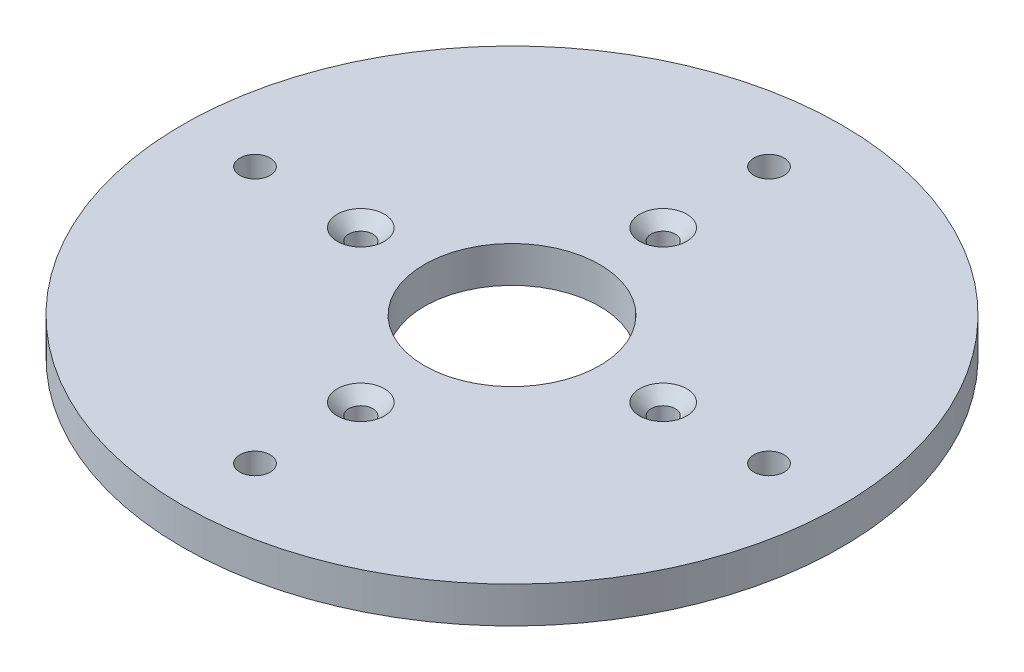
ISO-10303-21;
HEADER;
FILE_DESCRIPTION(('STEP AP214'),'2;1');
FILE_NAME('part.step','',(''),(''),'','','');
FILE_SCHEMA(('AUTOMOTIVE_DESIGN { 1 0 10303 214 1 1 1 1 }'));
ENDSEC;
DATA;
#1=APPLICATION_CONTEXT('core data for automotive mechanical design processes');
#2=APPLICATION_PROTOCOL_DEFINITION('international standard','automotive_design',2000,#1);
#3=PRODUCT_CONTEXT('',#1,'mechanical');
#4=PRODUCT('Part','Part','',(#3));
#5=PRODUCT_RELATED_PRODUCT_CATEGORY('part','',(#4));
#6=PRODUCT_DEFINITION_FORMATION('','',#4);
#7=PRODUCT_DEFINITION_CONTEXT('part definition',#1,'design');
#8=PRODUCT_DEFINITION('design','',#6,#7);
#9=PRODUCT_DEFINITION_SHAPE('','',#8);
#10=(LENGTH_UNIT() NAMED_UNIT(*) SI_UNIT(.MILLI.,.METRE.));
#11=(NAMED_UNIT(*) PLANE_ANGLE_UNIT() SI_UNIT($,.RADIAN.));
#12=(NAMED_UNIT(*) SI_UNIT($,.STERADIAN.) SOLID_ANGLE_UNIT());
#13=UNCERTAINTY_MEASURE_WITH_UNIT(LENGTH_MEASURE(1.E-05),#10,'distance_accuracy_value','');
#14=(GEOMETRIC_REPRESENTATION_CONTEXT(3) GLOBAL_UNCERTAINTY_ASSIGNED_CONTEXT((#13)) GLOBAL_UNIT_ASSIGNED_CONTEXT((#10,
#11,#12)) REPRESENTATION_CONTEXT('',''));
#15=CARTESIAN_POINT('',(0.,0.,0.));
#16=DIRECTION('',(0.,0.,1.));
#17=DIRECTION('',(1.,0.,0.));
#18=AXIS2_PLACEMENT_3D('',#15,#16,#17);
#19=CARTESIAN_POINT('',(0.,6.,0.));
#20=DIRECTION('',(0.,1.,0.));
#21=DIRECTION('',(0.,0.,1.));
#22=AXIS2_PLACEMENT_3D('',#19,#20,#21);
#23=PLANE('',#22);
#24=CARTESIAN_POINT('',(0.,6.,-25.));
#25=DIRECTION('',(0.,1.,0.));
#26=DIRECTION('',(0.,0.,1.));
#27=AXIS2_PLACEMENT_3D('',#24,#25,#26);
#28=CIRCLE('',#27,3.90000000000004);
#29=CARTESIAN_POINT('',(0.,6.,-21.1));
#30=VERTEX_POINT('',#29);
#31=EDGE_CURVE('E45',#30,#30,#28,.F.);
#32=ORIENTED_EDGE('',*,*,#31,.T.);
#33=EDGE_LOOP('',(#32));
#34=FACE_BOUND('',#33,.T.);
#35=CARTESIAN_POINT('',(25.,6.,0.));
#36=DIRECTION('',(0.,1.,0.));
#37=DIRECTION('',(0.,0.,1.));
#38=AXIS2_PLACEMENT_3D('',#35,#36,#37);
#39=CIRCLE('',#38,3.9);
#40=CARTESIAN_POINT('',(25.,6.,3.9));
#41=VERTEX_POINT('',#40);
#42=EDGE_CURVE('E50',#41,#41,#39,.F.);
#43=ORIENTED_EDGE('',*,*,#42,.T.);
#44=EDGE_LOOP('',(#43));
#45=FACE_BOUND('',#44,.T.);
#46=CARTESIAN_POINT('',(0.,6.,25.));
#47=DIRECTION('',(0.,1.,0.));
#48=DIRECTION('',(0.,0.,1.));
#49=AXIS2_PLACEMENT_3D('',#46,#47,#48);
#50=CIRCLE('',#49,3.9);
#51=CARTESIAN_POINT('',(0.,6.,28.9));
#52=VERTEX_POINT('',#51);
#53=EDGE_CURVE('E53',#52,#52,#50,.F.);
#54=ORIENTED_EDGE('',*,*,#53,.T.);
#55=EDGE_LOOP('',(#54));
#56=FACE_BOUND('',#55,.T.);
#57=CARTESIAN_POINT('',(-25.,6.,0.));
#58=DIRECTION('',(0.,1.,0.));
#59=DIRECTION('',(0.,0.,1.));
#60=AXIS2_PLACEMENT_3D('',#57,#58,#59);
#61=CIRCLE('',#60,3.9);
#62=CARTESIAN_POINT('',(-25.,6.,3.9));
#63=VERTEX_POINT('',#62);
#64=EDGE_CURVE('E56',#63,#63,#61,.F.);
#65=ORIENTED_EDGE('',*,*,#64,.T.);
#66=EDGE_LOOP('',(#65));
#67=FACE_BOUND('',#66,.T.);
#68=CARTESIAN_POINT('',(42.5,6.,0.));
#69=DIRECTION('',(0.,1.,0.));
#70=DIRECTION('',(0.,0.,1.));
#71=AXIS2_PLACEMENT_3D('',#68,#69,#70);
#72=CIRCLE('',#71,2.5);
#73=CARTESIAN_POINT('',(42.5,6.,2.5));
#74=VERTEX_POINT('',#73);
#75=EDGE_CURVE('E75',#74,#74,#72,.T.);
#76=ORIENTED_EDGE('',*,*,#75,.F.);
#77=EDGE_LOOP('',(#76));
#78=FACE_BOUND('',#77,.T.);
#79=CARTESIAN_POINT('',(-42.5,6.,0.));
#80=DIRECTION('',(0.,1.,0.));
#81=DIRECTION('',(0.,0.,1.));
#82=AXIS2_PLACEMENT_3D('',#79,#80,#81);
#83=CIRCLE('',#82,2.5);
#84=CARTESIAN_POINT('',(-42.5,6.,2.5));
#85=VERTEX_POINT('',#84);
#86=EDGE_CURVE('E79',#85,#85,#83,.T.);
#87=ORIENTED_EDGE('',*,*,#86,.F.);
#88=EDGE_LOOP('',(#87));
#89=FACE_BOUND('',#88,.T.);
#90=CARTESIAN_POINT('',(0.,6.,42.5));
#91=DIRECTION('',(0.,1.,0.));
#92=DIRECTION('',(0.,0.,1.));
#93=AXIS2_PLACEMENT_3D('',#90,#91,#92);
#94=CIRCLE('',#93,2.5);
#95=CARTESIAN_POINT('',(0.,6.,45.));
#96=VERTEX_POINT('',#95);
#97=EDGE_CURVE('E83',#96,#96,#94,.T.);
#98=ORIENTED_EDGE('',*,*,#97,.F.);
#99=EDGE_LOOP('',(#98));
#100=FACE_BOUND('',#99,.T.);
#101=CARTESIAN_POINT('',(0.,6.,-42.5));
#102=DIRECTION('',(0.,1.,0.));
#103=DIRECTION('',(0.,0.,1.));
#104=AXIS2_PLACEMENT_3D('',#101,#102,#103);
#105=CIRCLE('',#104,2.5);
#106=CARTESIAN_POINT('',(0.,6.,-40.));
#107=VERTEX_POINT('',#106);
#108=EDGE_CURVE('E87',#107,#107,#105,.T.);
#109=ORIENTED_EDGE('',*,*,#108,.F.);
#110=EDGE_LOOP('',(#109));
#111=FACE_BOUND('',#110,.T.);
#112=CARTESIAN_POINT('',(0.,6.,0.));
#113=DIRECTION('',(0.,1.,0.));
#114=DIRECTION('',(0.,0.,1.));
#115=AXIS2_PLACEMENT_3D('',#112,#113,#114);
#116=CIRCLE('',#115,54.5);
#117=CARTESIAN_POINT('',(0.,6.,54.5));
#118=VERTEX_POINT('',#117);
#119=EDGE_CURVE('E62',#118,#118,#116,.T.);
#120=ORIENTED_EDGE('',*,*,#119,.T.);
#121=EDGE_LOOP('',(#120));
#122=FACE_BOUND('',#121,.T.);
#123=CARTESIAN_POINT('',(0.,6.,0.));
#124=DIRECTION('',(0.,1.,0.));
#125=DIRECTION('',(0.,0.,1.));
#126=AXIS2_PLACEMENT_3D('',#123,#124,#125);
#127=CIRCLE('',#126,14.5);
#128=CARTESIAN_POINT('',(0.,6.,14.5));
#129=VERTEX_POINT('',#128);
#130=EDGE_CURVE('E95',#129,#129,#127,.T.);
#131=ORIENTED_EDGE('',*,*,#130,.F.);
#132=EDGE_LOOP('',(#131));
#133=FACE_BOUND('',#132,.T.);
#134=ADVANCED_FACE('F30',(#34,#45,#56,#67,#78,#89,#100,#111,#122,#133),#23,.T.);
#135=CARTESIAN_POINT('',(0.,0.,0.));
#136=DIRECTION('',(0.,1.,0.));
#137=DIRECTION('',(0.,0.,1.));
#138=AXIS2_PLACEMENT_3D('',#135,#136,#137);
#139=PLANE('',#138);
#140=CARTESIAN_POINT('',(25.,0.,0.));
#141=DIRECTION('',(0.,1.,0.));
#142=DIRECTION('',(0.,0.,1.));
#143=AXIS2_PLACEMENT_3D('',#140,#141,#142);
#144=CIRCLE('',#143,2.);
#145=CARTESIAN_POINT('',(25.,0.,2.));
#146=VERTEX_POINT('',#145);
#147=EDGE_CURVE('E63',#146,#146,#144,.T.);
#148=ORIENTED_EDGE('',*,*,#147,.T.);
#149=EDGE_LOOP('',(#148));
#150=FACE_BOUND('',#149,.T.);
#151=CARTESIAN_POINT('',(0.,0.,25.));
#152=DIRECTION('',(0.,1.,0.));
#153=DIRECTION('',(0.,0.,1.));
#154=AXIS2_PLACEMENT_3D('',#151,#152,#153);
#155=CIRCLE('',#154,2.);
#156=CARTESIAN_POINT('',(0.,0.,27.));
#157=VERTEX_POINT('',#156);
#158=EDGE_CURVE('E66',#157,#157,#155,.T.);
#159=ORIENTED_EDGE('',*,*,#158,.T.);
#160=EDGE_LOOP('',(#159));
#161=FACE_BOUND('',#160,.T.);
#162=CARTESIAN_POINT('',(-25.,0.,0.));
#163=DIRECTION('',(0.,1.,0.));
#164=DIRECTION('',(0.,0.,1.));
#165=AXIS2_PLACEMENT_3D('',#162,#163,#164);
#166=CIRCLE('',#165,2.);
#167=CARTESIAN_POINT('',(-25.,0.,2.));
#168=VERTEX_POINT('',#167);
#169=EDGE_CURVE('E69',#168,#168,#166,.T.);
#170=ORIENTED_EDGE('',*,*,#169,.T.);
#171=EDGE_LOOP('',(#170));
#172=FACE_BOUND('',#171,.T.);
#173=CARTESIAN_POINT('',(0.,0.,-25.));
#174=DIRECTION('',(0.,1.,0.));
#175=DIRECTION('',(0.,0.,1.));
#176=AXIS2_PLACEMENT_3D('',#173,#174,#175);
#177=CIRCLE('',#176,2.);
#178=CARTESIAN_POINT('',(0.,0.,-23.));
#179=VERTEX_POINT('',#178);
#180=EDGE_CURVE('E72',#179,#179,#177,.T.);
#181=ORIENTED_EDGE('',*,*,#180,.T.);
#182=EDGE_LOOP('',(#181));
#183=FACE_BOUND('',#182,.T.);
#184=CARTESIAN_POINT('',(42.5,0.,0.));
#185=DIRECTION('',(0.,1.,0.));
#186=DIRECTION('',(0.,0.,1.));
#187=AXIS2_PLACEMENT_3D('',#184,#185,#186);
#188=CIRCLE('',#187,2.5);
#189=CARTESIAN_POINT('',(42.5,0.,2.5));
#190=VERTEX_POINT('',#189);
#191=EDGE_CURVE('E76',#190,#190,#188,.T.);
#192=ORIENTED_EDGE('',*,*,#191,.T.);
#193=EDGE_LOOP('',(#192));
#194=FACE_BOUND('',#193,.T.);
#195=CARTESIAN_POINT('',(-42.5,0.,0.));
#196=DIRECTION('',(0.,1.,0.));
#197=DIRECTION('',(0.,0.,1.));
#198=AXIS2_PLACEMENT_3D('',#195,#196,#197);
#199=CIRCLE('',#198,2.5);
#200=CARTESIAN_POINT('',(-42.5,0.,2.5));
#201=VERTEX_POINT('',#200);
#202=EDGE_CURVE('E80',#201,#201,#199,.T.);
#203=ORIENTED_EDGE('',*,*,#202,.T.);
#204=EDGE_LOOP('',(#203));
#205=FACE_BOUND('',#204,.T.);
#206=CARTESIAN_POINT('',(0.,0.,42.5));
#207=DIRECTION('',(0.,1.,0.));
#208=DIRECTION('',(0.,0.,1.));
#209=AXIS2_PLACEMENT_3D('',#206,#207,#208);
#210=CIRCLE('',#209,2.5);
#211=CARTESIAN_POINT('',(0.,0.,45.));
#212=VERTEX_POINT('',#211);
#213=EDGE_CURVE('E84',#212,#212,#210,.T.);
#214=ORIENTED_EDGE('',*,*,#213,.T.);
#215=EDGE_LOOP('',(#214));
#216=FACE_BOUND('',#215,.T.);
#217=CARTESIAN_POINT('',(0.,0.,-42.5));
#218=DIRECTION('',(0.,1.,0.));
#219=DIRECTION('',(0.,0.,1.));
#220=AXIS2_PLACEMENT_3D('',#217,#218,#219);
#221=CIRCLE('',#220,2.5);
#222=CARTESIAN_POINT('',(0.,0.,-40.));
#223=VERTEX_POINT('',#222);
#224=EDGE_CURVE('E88',#223,#223,#221,.T.);
#225=ORIENTED_EDGE('',*,*,#224,.T.);
#226=EDGE_LOOP('',(#225));
#227=FACE_BOUND('',#226,.T.);
#228=CARTESIAN_POINT('',(0.,0.,0.));
#229=DIRECTION('',(0.,1.,0.));
#230=DIRECTION('',(0.,0.,1.));
#231=AXIS2_PLACEMENT_3D('',#228,#229,#230);
#232=CIRCLE('',#231,54.5);
#233=CARTESIAN_POINT('',(0.,0.,54.5));
#234=VERTEX_POINT('',#233);
#235=EDGE_CURVE('E92',#234,#234,#232,.T.);
#236=ORIENTED_EDGE('',*,*,#235,.F.);
#237=EDGE_LOOP('',(#236));
#238=FACE_BOUND('',#237,.T.);
#239=CARTESIAN_POINT('',(0.,0.,0.));
#240=DIRECTION('',(0.,1.,0.));
#241=DIRECTION('',(0.,0.,1.));
#242=AXIS2_PLACEMENT_3D('',#239,#240,#241);
#243=CIRCLE('',#242,14.5);
#244=CARTESIAN_POINT('',(0.,0.,14.5));
#245=VERTEX_POINT('',#244);
#246=EDGE_CURVE('E91',#245,#245,#243,.T.);
#247=ORIENTED_EDGE('',*,*,#246,.T.);
#248=EDGE_LOOP('',(#247));
#249=FACE_BOUND('',#248,.T.);
#250=ADVANCED_FACE('F116',(#150,#161,#172,#183,#194,#205,#216,#227,#238,#249),#139,.F.);
#251=CARTESIAN_POINT('',(0.,6.,0.));
#252=DIRECTION('',(0.,-1.,0.));
#253=DIRECTION('',(0.,0.,-1.));
#254=AXIS2_PLACEMENT_3D('',#251,#252,#253);
#255=CYLINDRICAL_SURFACE('',#254,54.5);
#256=ORIENTED_EDGE('',*,*,#119,.F.);
#257=EDGE_LOOP('',(#256));
#258=FACE_BOUND('',#257,.T.);
#259=ORIENTED_EDGE('',*,*,#235,.T.);
#260=EDGE_LOOP('',(#259));
#261=FACE_BOUND('',#260,.T.);
#262=ADVANCED_FACE('F133',(#258,#261),#255,.T.);
#263=CARTESIAN_POINT('',(0.,6.,0.));
#264=DIRECTION('',(0.,-1.,0.));
#265=DIRECTION('',(0.,0.,-1.));
#266=AXIS2_PLACEMENT_3D('',#263,#264,#265);
#267=CYLINDRICAL_SURFACE('',#266,14.5);
#268=ORIENTED_EDGE('',*,*,#130,.T.);
#269=EDGE_LOOP('',(#268));
#270=FACE_BOUND('',#269,.T.);
#271=ORIENTED_EDGE('',*,*,#246,.F.);
#272=EDGE_LOOP('',(#271));
#273=FACE_BOUND('',#272,.T.);
#274=ADVANCED_FACE('F129',(#270,#273),#267,.F.);
#275=CARTESIAN_POINT('',(0.,-4.,-42.5));
#276=DIRECTION('',(0.,1.,0.));
#277=DIRECTION('',(0.,0.,1.));
#278=AXIS2_PLACEMENT_3D('',#275,#276,#277);
#279=CYLINDRICAL_SURFACE('',#278,2.5);
#280=ORIENTED_EDGE('',*,*,#108,.T.);
#281=EDGE_LOOP('',(#280));
#282=FACE_BOUND('',#281,.T.);
#283=ORIENTED_EDGE('',*,*,#224,.F.);
#284=EDGE_LOOP('',(#283));
#285=FACE_BOUND('',#284,.T.);
#286=ADVANCED_FACE('F132',(#282,#285),#279,.F.);
#287=CARTESIAN_POINT('',(0.,-4.,42.5));
#288=DIRECTION('',(0.,1.,0.));
#289=DIRECTION('',(0.,0.,1.));
#290=AXIS2_PLACEMENT_3D('',#287,#288,#289);
#291=CYLINDRICAL_SURFACE('',#290,2.5);
#292=ORIENTED_EDGE('',*,*,#97,.T.);
#293=EDGE_LOOP('',(#292));
#294=FACE_BOUND('',#293,.T.);
#295=ORIENTED_EDGE('',*,*,#213,.F.);
#296=EDGE_LOOP('',(#295));
#297=FACE_BOUND('',#296,.T.);
#298=ADVANCED_FACE('F252',(#294,#297),#291,.F.);
#299=CARTESIAN_POINT('',(-42.5,-4.,0.));
#300=DIRECTION('',(0.,1.,0.));
#301=DIRECTION('',(0.,0.,1.));
#302=AXIS2_PLACEMENT_3D('',#299,#300,#301);
#303=CYLINDRICAL_SURFACE('',#302,2.5);
#304=ORIENTED_EDGE('',*,*,#86,.T.);
#305=EDGE_LOOP('',(#304));
#306=FACE_BOUND('',#305,.T.);
#307=ORIENTED_EDGE('',*,*,#202,.F.);
#308=EDGE_LOOP('',(#307));
#309=FACE_BOUND('',#308,.T.);
#310=ADVANCED_FACE('F243',(#306,#309),#303,.F.);
#311=CARTESIAN_POINT('',(42.5,-4.,0.));
#312=DIRECTION('',(0.,1.,0.));
#313=DIRECTION('',(0.,0.,1.));
#314=AXIS2_PLACEMENT_3D('',#311,#312,#313);
#315=CYLINDRICAL_SURFACE('',#314,2.5);
#316=ORIENTED_EDGE('',*,*,#75,.T.);
#317=EDGE_LOOP('',(#316));
#318=FACE_BOUND('',#317,.T.);
#319=ORIENTED_EDGE('',*,*,#191,.F.);
#320=EDGE_LOOP('',(#319));
#321=FACE_BOUND('',#320,.T.);
#322=ADVANCED_FACE('F111',(#318,#321),#315,.F.);
#323=CARTESIAN_POINT('',(0.,-4.,-25.));
#324=DIRECTION('',(0.,1.,0.));
#325=DIRECTION('',(0.,0.,1.));
#326=AXIS2_PLACEMENT_3D('',#323,#324,#325);
#327=CYLINDRICAL_SURFACE('',#326,2.);
#328=CARTESIAN_POINT('',(0.,4.09999999999995,-25.));
#329=DIRECTION('',(0.,1.,0.));
#330=DIRECTION('',(0.,0.,1.));
#331=AXIS2_PLACEMENT_3D('',#328,#329,#330);
#332=CIRCLE('',#331,2.);
#333=CARTESIAN_POINT('',(0.,4.09999999999995,-23.));
#334=VERTEX_POINT('',#333);
#335=EDGE_CURVE('E59',#334,#334,#332,.T.);
#336=ORIENTED_EDGE('',*,*,#335,.T.);
#337=EDGE_LOOP('',(#336));
#338=FACE_BOUND('',#337,.T.);
#339=ORIENTED_EDGE('',*,*,#180,.F.);
#340=EDGE_LOOP('',(#339));
#341=FACE_BOUND('',#340,.T.);
#342=ADVANCED_FACE('F214',(#338,#341),#327,.F.);
#343=CARTESIAN_POINT('',(-25.,-4.,0.));
#344=DIRECTION('',(0.,1.,0.));
#345=DIRECTION('',(0.,0.,1.));
#346=AXIS2_PLACEMENT_3D('',#343,#344,#345);
#347=CYLINDRICAL_SURFACE('',#346,2.);
#348=CARTESIAN_POINT('',(-25.,4.1,0.));
#349=DIRECTION('',(0.,1.,0.));
#350=DIRECTION('',(0.,0.,1.));
#351=AXIS2_PLACEMENT_3D('',#348,#349,#350);
#352=CIRCLE('',#351,2.);
#353=CARTESIAN_POINT('',(-25.,4.1,2.));
#354=VERTEX_POINT('',#353);
#355=EDGE_CURVE('E10',#354,#354,#352,.T.);
#356=ORIENTED_EDGE('',*,*,#355,.T.);
#357=EDGE_LOOP('',(#356));
#358=FACE_BOUND('',#357,.T.);
#359=ORIENTED_EDGE('',*,*,#169,.F.);
#360=EDGE_LOOP('',(#359));
#361=FACE_BOUND('',#360,.T.);
#362=ADVANCED_FACE('F205',(#358,#361),#347,.F.);
#363=CARTESIAN_POINT('',(0.,-4.,25.));
#364=DIRECTION('',(0.,1.,0.));
#365=DIRECTION('',(0.,0.,1.));
#366=AXIS2_PLACEMENT_3D('',#363,#364,#365);
#367=CYLINDRICAL_SURFACE('',#366,2.);
#368=CARTESIAN_POINT('',(0.,4.09999999999999,25.));
#369=DIRECTION('',(0.,1.,0.));
#370=DIRECTION('',(0.,0.,1.));
#371=AXIS2_PLACEMENT_3D('',#368,#369,#370);
#372=CIRCLE('',#371,2.);
#373=CARTESIAN_POINT('',(0.,4.09999999999999,27.));
#374=VERTEX_POINT('',#373);
#375=EDGE_CURVE('E37',#374,#374,#372,.T.);
#376=ORIENTED_EDGE('',*,*,#375,.T.);
#377=EDGE_LOOP('',(#376));
#378=FACE_BOUND('',#377,.T.);
#379=ORIENTED_EDGE('',*,*,#158,.F.);
#380=EDGE_LOOP('',(#379));
#381=FACE_BOUND('',#380,.T.);
#382=ADVANCED_FACE('F195',(#378,#381),#367,.F.);
#383=CARTESIAN_POINT('',(25.,-4.,0.));
#384=DIRECTION('',(0.,1.,0.));
#385=DIRECTION('',(0.,0.,1.));
#386=AXIS2_PLACEMENT_3D('',#383,#384,#385);
#387=CYLINDRICAL_SURFACE('',#386,2.);
#388=CARTESIAN_POINT('',(25.,4.1,0.));
#389=DIRECTION('',(0.,1.,0.));
#390=DIRECTION('',(0.,0.,1.));
#391=AXIS2_PLACEMENT_3D('',#388,#389,#390);
#392=CIRCLE('',#391,2.);
#393=CARTESIAN_POINT('',(25.,4.1,2.));
#394=VERTEX_POINT('',#393);
#395=EDGE_CURVE('E41',#394,#394,#392,.T.);
#396=ORIENTED_EDGE('',*,*,#395,.T.);
#397=EDGE_LOOP('',(#396));
#398=FACE_BOUND('',#397,.T.);
#399=ORIENTED_EDGE('',*,*,#147,.F.);
#400=EDGE_LOOP('',(#399));
#401=FACE_BOUND('',#400,.T.);
#402=ADVANCED_FACE('F151',(#398,#401),#387,.F.);
#403=CARTESIAN_POINT('',(0.,4.09999999999995,-25.));
#404=DIRECTION('',(0.,1.,0.));
#405=DIRECTION('',(0.,0.,1.));
#406=AXIS2_PLACEMENT_3D('',#403,#404,#405);
#407=CONICAL_SURFACE('',#406,2.,0.785398163397446);
#408=CARTESIAN_POINT('',(0.,6.,-21.1));
#409=CARTESIAN_POINT('',(0.,5.98020833333333,-21.1197916666666));
#410=CARTESIAN_POINT('',(0.,5.96041666666667,-21.1395833333333));
#411=CARTESIAN_POINT('',(0.,5.92083333333333,-21.1791666666666));
#412=CARTESIAN_POINT('',(0.,5.90104166666666,-21.1989583333333));
#413=CARTESIAN_POINT('',(0.,5.86145833333333,-21.2385416666666));
#414=CARTESIAN_POINT('',(0.,5.84166666666666,-21.2583333333333));
#415=CARTESIAN_POINT('',(0.,5.80208333333333,-21.2979166666666));
#416=CARTESIAN_POINT('',(0.,5.78229166666666,-21.3177083333333));
#417=CARTESIAN_POINT('',(0.,5.74270833333333,-21.3572916666666));
#418=CARTESIAN_POINT('',(0.,5.72291666666666,-21.3770833333333));
#419=CARTESIAN_POINT('',(0.,5.68333333333332,-21.4166666666666));
#420=CARTESIAN_POINT('',(0.,5.66354166666666,-21.4364583333333));
#421=CARTESIAN_POINT('',(0.,5.62395833333332,-21.4760416666666));
#422=CARTESIAN_POINT('',(0.,5.60416666666666,-21.4958333333333));
#423=CARTESIAN_POINT('',(0.,5.56458333333332,-21.5354166666666));
#424=CARTESIAN_POINT('',(0.,5.54479166666665,-21.5552083333333));
#425=CARTESIAN_POINT('',(0.,5.50520833333332,-21.5947916666666));
#426=CARTESIAN_POINT('',(0.,5.48541666666665,-21.6145833333333));
#427=CARTESIAN_POINT('',(0.,5.44583333333332,-21.6541666666666));
#428=CARTESIAN_POINT('',(0.,5.42604166666665,-21.6739583333333));
#429=CARTESIAN_POINT('',(0.,5.38645833333332,-21.7135416666666));
#430=CARTESIAN_POINT('',(0.,5.36666666666665,-21.7333333333333));
#431=CARTESIAN_POINT('',(0.,5.32708333333332,-21.7729166666666));
#432=CARTESIAN_POINT('',(0.,5.30729166666665,-21.7927083333333));
#433=CARTESIAN_POINT('',(0.,5.26770833333331,-21.8322916666666));
#434=CARTESIAN_POINT('',(0.,5.24791666666665,-21.8520833333333));
#435=CARTESIAN_POINT('',(0.,5.20833333333331,-21.8916666666666));
#436=CARTESIAN_POINT('',(0.,5.18854166666665,-21.9114583333333));
#437=CARTESIAN_POINT('',(0.,5.14895833333331,-21.9510416666666));
#438=CARTESIAN_POINT('',(0.,5.12916666666664,-21.9708333333333));
#439=CARTESIAN_POINT('',(0.,5.08958333333331,-22.0104166666666));
#440=CARTESIAN_POINT('',(0.,5.06979166666664,-22.0302083333333));
#441=CARTESIAN_POINT('',(0.,5.03020833333331,-22.0697916666666));
#442=CARTESIAN_POINT('',(0.,5.01041666666664,-22.0895833333333));
#443=CARTESIAN_POINT('',(0.,4.97083333333331,-22.1291666666666));
#444=CARTESIAN_POINT('',(0.,4.95104166666664,-22.1489583333333));
#445=CARTESIAN_POINT('',(0.,4.9114583333333,-22.1885416666667));
#446=CARTESIAN_POINT('',(0.,4.89166666666664,-22.2083333333333));
#447=CARTESIAN_POINT('',(0.,4.8520833333333,-22.2479166666667));
#448=CARTESIAN_POINT('',(0.,4.83229166666664,-22.2677083333333));
#449=CARTESIAN_POINT('',(0.,4.7927083333333,-22.3072916666667));
#450=CARTESIAN_POINT('',(0.,4.77291666666663,-22.3270833333333));
#451=CARTESIAN_POINT('',(0.,4.7333333333333,-22.3666666666667));
#452=CARTESIAN_POINT('',(0.,4.71354166666663,-22.3864583333333));
#453=CARTESIAN_POINT('',(0.,4.6739583333333,-22.4260416666667));
#454=CARTESIAN_POINT('',(0.,4.65416666666663,-22.4458333333333));
#455=CARTESIAN_POINT('',(0.,4.6145833333333,-22.4854166666667));
#456=CARTESIAN_POINT('',(0.,4.59479166666663,-22.5052083333333));
#457=CARTESIAN_POINT('',(0.,4.5552083333333,-22.5447916666667));
#458=CARTESIAN_POINT('',(0.,4.53541666666663,-22.5645833333333));
#459=CARTESIAN_POINT('',(0.,4.49583333333329,-22.6041666666667));
#460=CARTESIAN_POINT('',(0.,4.47604166666663,-22.6239583333333));
#461=CARTESIAN_POINT('',(0.,4.43645833333329,-22.6635416666667));
#462=CARTESIAN_POINT('',(0.,4.41666666666662,-22.6833333333333));
#463=CARTESIAN_POINT('',(0.,4.37708333333329,-22.7229166666667));
#464=CARTESIAN_POINT('',(0.,4.35729166666662,-22.7427083333333));
#465=CARTESIAN_POINT('',(0.,4.31770833333329,-22.7822916666667));
#466=CARTESIAN_POINT('',(0.,4.29791666666662,-22.8020833333333));
#467=CARTESIAN_POINT('',(0.,4.25833333333329,-22.8416666666667));
#468=CARTESIAN_POINT('',(0.,4.23854166666662,-22.8614583333333));
#469=CARTESIAN_POINT('',(0.,4.19895833333329,-22.9010416666667));
#470=CARTESIAN_POINT('',(0.,4.17916666666662,-22.9208333333333));
#471=CARTESIAN_POINT('',(0.,4.13958333333329,-22.9604166666667));
#472=CARTESIAN_POINT('',(0.,4.11979166666662,-22.9802083333333));
#473=CARTESIAN_POINT('',(0.,4.09999999999995,-23.));
#474=B_SPLINE_CURVE_WITH_KNOTS('',3,(#408,#409,#410,#411,#412,#413,#414,#415,#416,#417,#418,
#419,#420,#421,#422,#423,#424,#425,#426,#427,#428,#429,#430,#431,#432,#433,#434,#435,#436,#437,
#438,#439,#440,#441,#442,#443,#444,#445,#446,#447,#448,#449,#450,#451,#452,#453,#454,#455,#456,
#457,#458,#459,#460,#461,#462,#463,#464,#465,#466,#467,#468,#469,#470,#471,#472,#473),
.UNSPECIFIED.,.F.,.F.,(4,2,2,2,2,2,2,2,2,2,2,2,2,2,2,2,2,2,2,2,2,2,2,2,2,2,2,2,2,2,2,2,4),(0.,
0.0839689302659037,0.167937860531807,0.251906790797714,0.335875721063618,0.419844651329522,
0.503813581595428,0.587782511861332,0.671751442127236,0.755720372393139,0.839689302659046,
0.92365823292495,1.00762716319085,1.09159609345676,1.17556502372266,1.25953395398857,
1.34350288425447,1.42747181452038,1.51144074478628,1.59540967505219,1.67937860531809,
1.763347535584,1.8473164658499,1.9312853961158,2.01525432638171,2.09922325664761,
2.18319218691352,2.26716111717942,2.35113004744533,2.43509897771123,2.51906790797714,
2.60303683824304,2.68700576850894),.UNSPECIFIED.);
#475=EDGE_CURVE('BSEAM147',#30,#334,#474,.T.);
#476=ORIENTED_EDGE('',*,*,#31,.F.);
#477=ORIENTED_EDGE('',*,*,#335,.F.);
#478=ORIENTED_EDGE('',*,*,#475,.T.);
#479=ORIENTED_EDGE('',*,*,#475,.F.);
#480=EDGE_LOOP('',(#476,#478,#477,#479));
#481=FACE_BOUND('',#480,.T.);
#482=ADVANCED_FACE('F147',(#481),#407,.F.);
#483=CARTESIAN_POINT('',(25.,4.1,0.));
#484=DIRECTION('',(0.,1.,0.));
#485=DIRECTION('',(0.,0.,1.));
#486=AXIS2_PLACEMENT_3D('',#483,#484,#485);
#487=CONICAL_SURFACE('',#486,2.,0.785398163397447);
#488=CARTESIAN_POINT('',(25.,6.,3.9));
#489=CARTESIAN_POINT('',(25.,5.98020833333333,3.88020833333333));
#490=CARTESIAN_POINT('',(25.,5.96041666666667,3.86041666666667));
#491=CARTESIAN_POINT('',(25.,5.92083333333333,3.82083333333333));
#492=CARTESIAN_POINT('',(25.,5.90104166666667,3.80104166666667));
#493=CARTESIAN_POINT('',(25.,5.86145833333333,3.76145833333333));
#494=CARTESIAN_POINT('',(25.,5.84166666666667,3.74166666666667));
#495=CARTESIAN_POINT('',(25.,5.80208333333333,3.70208333333333));
#496=CARTESIAN_POINT('',(25.,5.78229166666666,3.68229166666667));
#497=CARTESIAN_POINT('',(25.,5.74270833333333,3.64270833333333));
#498=CARTESIAN_POINT('',(25.,5.72291666666667,3.62291666666667));
#499=CARTESIAN_POINT('',(25.,5.68333333333333,3.58333333333333));
#500=CARTESIAN_POINT('',(25.,5.66354166666667,3.56354166666667));
#501=CARTESIAN_POINT('',(25.,5.62395833333333,3.52395833333333));
#502=CARTESIAN_POINT('',(25.,5.60416666666667,3.50416666666667));
#503=CARTESIAN_POINT('',(25.,5.56458333333333,3.46458333333333));
#504=CARTESIAN_POINT('',(25.,5.54479166666667,3.44479166666667));
#505=CARTESIAN_POINT('',(25.,5.50520833333333,3.40520833333333));
#506=CARTESIAN_POINT('',(25.,5.48541666666667,3.38541666666667));
#507=CARTESIAN_POINT('',(25.,5.44583333333333,3.34583333333333));
#508=CARTESIAN_POINT('',(25.,5.42604166666666,3.32604166666667));
#509=CARTESIAN_POINT('',(25.,5.38645833333333,3.28645833333333));
#510=CARTESIAN_POINT('',(25.,5.36666666666666,3.26666666666667));
#511=CARTESIAN_POINT('',(25.,5.32708333333333,3.22708333333333));
#512=CARTESIAN_POINT('',(25.,5.30729166666667,3.20729166666667));
#513=CARTESIAN_POINT('',(25.,5.26770833333333,3.16770833333333));
#514=CARTESIAN_POINT('',(25.,5.24791666666667,3.14791666666667));
#515=CARTESIAN_POINT('',(25.,5.20833333333333,3.10833333333333));
#516=CARTESIAN_POINT('',(25.,5.18854166666666,3.08854166666667));
#517=CARTESIAN_POINT('',(25.,5.14895833333333,3.04895833333333));
#518=CARTESIAN_POINT('',(25.,5.12916666666666,3.02916666666667));
#519=CARTESIAN_POINT('',(25.,5.08958333333333,2.98958333333333));
#520=CARTESIAN_POINT('',(25.,5.06979166666666,2.96979166666667));
#521=CARTESIAN_POINT('',(25.,5.03020833333333,2.93020833333333));
#522=CARTESIAN_POINT('',(25.,5.01041666666666,2.91041666666667));
#523=CARTESIAN_POINT('',(25.,4.97083333333333,2.87083333333333));
#524=CARTESIAN_POINT('',(25.,4.95104166666666,2.85104166666667));
#525=CARTESIAN_POINT('',(25.,4.91145833333333,2.81145833333333));
#526=CARTESIAN_POINT('',(25.,4.89166666666666,2.79166666666667));
#527=CARTESIAN_POINT('',(25.,4.85208333333333,2.75208333333333));
#528=CARTESIAN_POINT('',(25.,4.83229166666666,2.73229166666667));
#529=CARTESIAN_POINT('',(25.,4.79270833333333,2.69270833333334));
#530=CARTESIAN_POINT('',(25.,4.77291666666666,2.67291666666667));
#531=CARTESIAN_POINT('',(25.,4.73333333333333,2.63333333333334));
#532=CARTESIAN_POINT('',(25.,4.71354166666666,2.61354166666667));
#533=CARTESIAN_POINT('',(25.,4.67395833333333,2.57395833333334));
#534=CARTESIAN_POINT('',(25.,4.65416666666666,2.55416666666667));
#535=CARTESIAN_POINT('',(25.,4.61458333333333,2.51458333333334));
#536=CARTESIAN_POINT('',(25.,4.59479166666666,2.49479166666667));
#537=CARTESIAN_POINT('',(25.,4.55520833333333,2.45520833333334));
#538=CARTESIAN_POINT('',(25.,4.53541666666666,2.43541666666667));
#539=CARTESIAN_POINT('',(25.,4.49583333333333,2.39583333333334));
#540=CARTESIAN_POINT('',(25.,4.47604166666666,2.37604166666667));
#541=CARTESIAN_POINT('',(25.,4.43645833333333,2.33645833333334));
#542=CARTESIAN_POINT('',(25.,4.41666666666666,2.31666666666667));
#543=CARTESIAN_POINT('',(25.,4.37708333333333,2.27708333333334));
#544=CARTESIAN_POINT('',(25.,4.35729166666666,2.25729166666667));
#545=CARTESIAN_POINT('',(25.,4.31770833333333,2.21770833333334));
#546=CARTESIAN_POINT('',(25.,4.29791666666666,2.19791666666667));
#547=CARTESIAN_POINT('',(25.,4.25833333333333,2.15833333333334));
#548=CARTESIAN_POINT('',(25.,4.23854166666666,2.13854166666667));
#549=CARTESIAN_POINT('',(25.,4.19895833333333,2.09895833333334));
#550=CARTESIAN_POINT('',(25.,4.17916666666666,2.07916666666667));
#551=CARTESIAN_POINT('',(25.,4.13958333333333,2.03958333333334));
#552=CARTESIAN_POINT('',(25.,4.11979166666666,2.01979166666667));
#553=CARTESIAN_POINT('',(25.,4.1,2.));
#554=B_SPLINE_CURVE_WITH_KNOTS('',3,(#488,#489,#490,#491,#492,#493,#494,#495,#496,#497,#498,
#499,#500,#501,#502,#503,#504,#505,#506,#507,#508,#509,#510,#511,#512,#513,#514,#515,#516,#517,
#518,#519,#520,#521,#522,#523,#524,#525,#526,#527,#528,#529,#530,#531,#532,#533,#534,#535,#536,
#537,#538,#539,#540,#541,#542,#543,#544,#545,#546,#547,#548,#549,#550,#551,#552,#553),
.UNSPECIFIED.,.F.,.F.,(4,2,2,2,2,2,2,2,2,2,2,2,2,2,2,2,2,2,2,2,2,2,2,2,2,2,2,2,2,2,2,2,4),(0.,
0.0839689302659022,0.167937860531805,0.251906790797708,0.33587572106361,0.419844651329513,
0.503813581595415,0.587782511861318,0.67175144212722,0.755720372393123,0.839689302659026,
0.923658232924928,1.00762716319083,1.09159609345673,1.17556502372264,1.25953395398854,
1.34350288425444,1.42747181452034,1.51144074478625,1.59540967505215,1.67937860531805,
1.76334753558395,1.84731646584986,1.93128539611576,2.01525432638166,2.09922325664756,
2.18319218691347,2.26716111717937,2.35113004744527,2.43509897771117,2.51906790797708,
2.60303683824298,2.68700576850888),.UNSPECIFIED.);
#555=EDGE_CURVE('BSEAM150',#41,#394,#554,.T.);
#556=ORIENTED_EDGE('',*,*,#42,.F.);
#557=ORIENTED_EDGE('',*,*,#395,.F.);
#558=ORIENTED_EDGE('',*,*,#555,.T.);
#559=ORIENTED_EDGE('',*,*,#555,.F.);
#560=EDGE_LOOP('',(#556,#558,#557,#559));
#561=FACE_BOUND('',#560,.T.);
#562=ADVANCED_FACE('F150',(#561),#487,.F.);
#563=CARTESIAN_POINT('',(0.,4.09999999999999,25.));
#564=DIRECTION('',(0.,1.,0.));
#565=DIRECTION('',(0.,0.,1.));
#566=AXIS2_PLACEMENT_3D('',#563,#564,#565);
#567=CONICAL_SURFACE('',#566,2.,0.785398163397446);
#568=ORIENTED_EDGE('',*,*,#53,.F.);
#569=EDGE_LOOP('',(#568));
#570=FACE_BOUND('',#569,.T.);
#571=ORIENTED_EDGE('',*,*,#375,.F.);
#572=EDGE_LOOP('',(#571));
#573=FACE_BOUND('',#572,.T.);
#574=ADVANCED_FACE('F154',(#570,#573),#567,.F.);
#575=CARTESIAN_POINT('',(-25.,4.1,0.));
#576=DIRECTION('',(0.,1.,0.));
#577=DIRECTION('',(0.,0.,1.));
#578=AXIS2_PLACEMENT_3D('',#575,#576,#577);
#579=CONICAL_SURFACE('',#578,2.,0.785398163397447);
#580=CARTESIAN_POINT('',(-25.,6.,3.9));
#581=CARTESIAN_POINT('',(-25.,5.98020833333333,3.88020833333333));
#582=CARTESIAN_POINT('',(-25.,5.96041666666667,3.86041666666667));
#583=CARTESIAN_POINT('',(-25.,5.92083333333333,3.82083333333333));
#584=CARTESIAN_POINT('',(-25.,5.90104166666667,3.80104166666667));
#585=CARTESIAN_POINT('',(-25.,5.86145833333333,3.76145833333333));
#586=CARTESIAN_POINT('',(-25.,5.84166666666667,3.74166666666667));
#587=CARTESIAN_POINT('',(-25.,5.80208333333333,3.70208333333333));
#588=CARTESIAN_POINT('',(-25.,5.78229166666666,3.68229166666667));
#589=CARTESIAN_POINT('',(-25.,5.74270833333333,3.64270833333333));
#590=CARTESIAN_POINT('',(-25.,5.72291666666667,3.62291666666667));
#591=CARTESIAN_POINT('',(-25.,5.68333333333333,3.58333333333333));
#592=CARTESIAN_POINT('',(-25.,5.66354166666667,3.56354166666667));
#593=CARTESIAN_POINT('',(-25.,5.62395833333333,3.52395833333333));
#594=CARTESIAN_POINT('',(-25.,5.60416666666667,3.50416666666667));
#595=CARTESIAN_POINT('',(-25.,5.56458333333333,3.46458333333333));
#596=CARTESIAN_POINT('',(-25.,5.54479166666667,3.44479166666667));
#597=CARTESIAN_POINT('',(-25.,5.50520833333333,3.40520833333333));
#598=CARTESIAN_POINT('',(-25.,5.48541666666667,3.38541666666667));
#599=CARTESIAN_POINT('',(-25.,5.44583333333333,3.34583333333333));
#600=CARTESIAN_POINT('',(-25.,5.42604166666666,3.32604166666667));
#601=CARTESIAN_POINT('',(-25.,5.38645833333333,3.28645833333333));
#602=CARTESIAN_POINT('',(-25.,5.36666666666666,3.26666666666667));
#603=CARTESIAN_POINT('',(-25.,5.32708333333333,3.22708333333333));
#604=CARTESIAN_POINT('',(-25.,5.30729166666667,3.20729166666667));
#605=CARTESIAN_POINT('',(-25.,5.26770833333333,3.16770833333333));
#606=CARTESIAN_POINT('',(-25.,5.24791666666667,3.14791666666667));
#607=CARTESIAN_POINT('',(-25.,5.20833333333333,3.10833333333333));
#608=CARTESIAN_POINT('',(-25.,5.18854166666666,3.08854166666667));
#609=CARTESIAN_POINT('',(-25.,5.14895833333333,3.04895833333333));
#610=CARTESIAN_POINT('',(-25.,5.12916666666666,3.02916666666667));
#611=CARTESIAN_POINT('',(-25.,5.08958333333333,2.98958333333333));
#612=CARTESIAN_POINT('',(-25.,5.06979166666666,2.96979166666667));
#613=CARTESIAN_POINT('',(-25.,5.03020833333333,2.93020833333333));
#614=CARTESIAN_POINT('',(-25.,5.01041666666666,2.91041666666667));
#615=CARTESIAN_POINT('',(-25.,4.97083333333333,2.87083333333333));
#616=CARTESIAN_POINT('',(-25.,4.95104166666666,2.85104166666667));
#617=CARTESIAN_POINT('',(-25.,4.91145833333333,2.81145833333333));
#618=CARTESIAN_POINT('',(-25.,4.89166666666666,2.79166666666667));
#619=CARTESIAN_POINT('',(-25.,4.85208333333333,2.75208333333333));
#620=CARTESIAN_POINT('',(-25.,4.83229166666666,2.73229166666667));
#621=CARTESIAN_POINT('',(-25.,4.79270833333333,2.69270833333334));
#622=CARTESIAN_POINT('',(-25.,4.77291666666666,2.67291666666667));
#623=CARTESIAN_POINT('',(-25.,4.73333333333333,2.63333333333334));
#624=CARTESIAN_POINT('',(-25.,4.71354166666666,2.61354166666667));
#625=CARTESIAN_POINT('',(-25.,4.67395833333333,2.57395833333334));
#626=CARTESIAN_POINT('',(-25.,4.65416666666666,2.55416666666667));
#627=CARTESIAN_POINT('',(-25.,4.61458333333333,2.51458333333334));
#628=CARTESIAN_POINT('',(-25.,4.59479166666666,2.49479166666667));
#629=CARTESIAN_POINT('',(-25.,4.55520833333333,2.45520833333334));
#630=CARTESIAN_POINT('',(-25.,4.53541666666666,2.43541666666667));
#631=CARTESIAN_POINT('',(-25.,4.49583333333333,2.39583333333334));
#632=CARTESIAN_POINT('',(-25.,4.47604166666666,2.37604166666667));
#633=CARTESIAN_POINT('',(-25.,4.43645833333333,2.33645833333334));
#634=CARTESIAN_POINT('',(-25.,4.41666666666666,2.31666666666667));
#635=CARTESIAN_POINT('',(-25.,4.37708333333333,2.27708333333334));
#636=CARTESIAN_POINT('',(-25.,4.35729166666666,2.25729166666667));
#637=CARTESIAN_POINT('',(-25.,4.31770833333333,2.21770833333334));
#638=CARTESIAN_POINT('',(-25.,4.29791666666666,2.19791666666667));
#639=CARTESIAN_POINT('',(-25.,4.25833333333333,2.15833333333334));
#640=CARTESIAN_POINT('',(-25.,4.23854166666666,2.13854166666667));
#641=CARTESIAN_POINT('',(-25.,4.19895833333333,2.09895833333334));
#642=CARTESIAN_POINT('',(-25.,4.17916666666666,2.07916666666667));
#643=CARTESIAN_POINT('',(-25.,4.13958333333333,2.03958333333334));
#644=CARTESIAN_POINT('',(-25.,4.11979166666666,2.01979166666667));
#645=CARTESIAN_POINT('',(-25.,4.1,2.));
#646=B_SPLINE_CURVE_WITH_KNOTS('',3,(#580,#581,#582,#583,#584,#585,#586,#587,#588,#589,#590,
#591,#592,#593,#594,#595,#596,#597,#598,#599,#600,#601,#602,#603,#604,#605,#606,#607,#608,#609,
#610,#611,#612,#613,#614,#615,#616,#617,#618,#619,#620,#621,#622,#623,#624,#625,#626,#627,#628,
#629,#630,#631,#632,#633,#634,#635,#636,#637,#638,#639,#640,#641,#642,#643,#644,#645),
.UNSPECIFIED.,.F.,.F.,(4,2,2,2,2,2,2,2,2,2,2,2,2,2,2,2,2,2,2,2,2,2,2,2,2,2,2,2,2,2,2,2,4),(0.,
0.0839689302659022,0.167937860531805,0.251906790797708,0.33587572106361,0.419844651329513,
0.503813581595415,0.587782511861318,0.67175144212722,0.755720372393123,0.839689302659026,
0.923658232924928,1.00762716319083,1.09159609345673,1.17556502372264,1.25953395398854,
1.34350288425444,1.42747181452034,1.51144074478625,1.59540967505215,1.67937860531805,
1.76334753558395,1.84731646584986,1.93128539611576,2.01525432638166,2.09922325664756,
2.18319218691347,2.26716111717937,2.35113004744527,2.43509897771117,2.51906790797708,
2.60303683824298,2.68700576850888),.UNSPECIFIED.);
#647=EDGE_CURVE('BSEAM32',#63,#354,#646,.T.);
#648=ORIENTED_EDGE('',*,*,#64,.F.);
#649=ORIENTED_EDGE('',*,*,#355,.F.);
#650=ORIENTED_EDGE('',*,*,#647,.T.);
#651=ORIENTED_EDGE('',*,*,#647,.F.);
#652=EDGE_LOOP('',(#648,#650,#649,#651));
#653=FACE_BOUND('',#652,.T.);
#654=ADVANCED_FACE('F32',(#653),#579,.F.);
#655=CLOSED_SHELL('',(#134,#250,#262,#274,#286,#298,#310,#322,#342,#362,#382,#402,#482,#562,
#574,#654));
#656=MANIFOLD_SOLID_BREP('B2',#655);
#657=ADVANCED_BREP_SHAPE_REPRESENTATION('',(#18,#656),#14);
#658=SHAPE_DEFINITION_REPRESENTATION(#9,#657);
ENDSEC;
END-ISO-10303-21;
